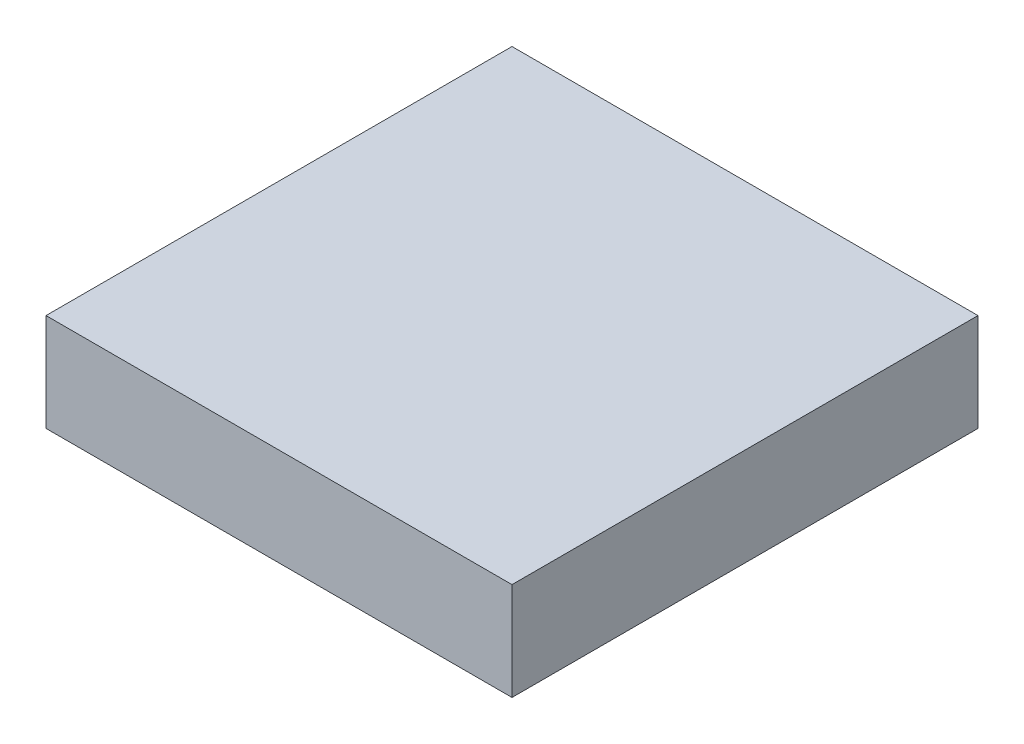
ISO-10303-21;
HEADER;
FILE_DESCRIPTION(('STEP AP214'),'2;1');
FILE_NAME('part.step','',(''),(''),'','','');
FILE_SCHEMA(('AUTOMOTIVE_DESIGN { 1 0 10303 214 1 1 1 1 }'));
ENDSEC;
DATA;
#1=APPLICATION_CONTEXT('core data for automotive mechanical design processes');
#2=APPLICATION_PROTOCOL_DEFINITION('international standard','automotive_design',2000,#1);
#3=PRODUCT_CONTEXT('',#1,'mechanical');
#4=PRODUCT('Part','Part','',(#3));
#5=PRODUCT_RELATED_PRODUCT_CATEGORY('part','',(#4));
#6=PRODUCT_DEFINITION_FORMATION('','',#4);
#7=PRODUCT_DEFINITION_CONTEXT('part definition',#1,'design');
#8=PRODUCT_DEFINITION('design','',#6,#7);
#9=PRODUCT_DEFINITION_SHAPE('','',#8);
#10=(LENGTH_UNIT() NAMED_UNIT(*) SI_UNIT(.MILLI.,.METRE.));
#11=(NAMED_UNIT(*) PLANE_ANGLE_UNIT() SI_UNIT($,.RADIAN.));
#12=(NAMED_UNIT(*) SI_UNIT($,.STERADIAN.) SOLID_ANGLE_UNIT());
#13=UNCERTAINTY_MEASURE_WITH_UNIT(LENGTH_MEASURE(1.E-05),#10,'distance_accuracy_value','');
#14=(GEOMETRIC_REPRESENTATION_CONTEXT(3) GLOBAL_UNCERTAINTY_ASSIGNED_CONTEXT((#13)) GLOBAL_UNIT_ASSIGNED_CONTEXT((#10,
#11,#12)) REPRESENTATION_CONTEXT('',''));
#15=CARTESIAN_POINT('',(0.,0.,0.));
#16=DIRECTION('',(0.,0.,1.));
#17=DIRECTION('',(1.,0.,0.));
#18=AXIS2_PLACEMENT_3D('',#15,#16,#17);
#19=CARTESIAN_POINT('',(0.,0.511,-2.436));
#20=DIRECTION('',(1.,0.,0.));
#21=DIRECTION('',(0.,0.,-1.));
#22=AXIS2_PLACEMENT_3D('',#19,#20,#21);
#23=PLANE('',#22);
#24=DIRECTION('',(0.,0.,1.));
#25=VECTOR('',#24,1.);
#26=CARTESIAN_POINT('',(0.,0.,-2.436));
#27=LINE('',#26,#25);
#28=CARTESIAN_POINT('',(0.,0.,-2.436));
#29=VERTEX_POINT('',#28);
#30=CARTESIAN_POINT('',(0.,0.,0.));
#31=VERTEX_POINT('',#30);
#32=EDGE_CURVE('E96',#29,#31,#27,.T.);
#33=ORIENTED_EDGE('',*,*,#32,.T.);
#34=DIRECTION('',(0.,-1.,0.));
#35=VECTOR('',#34,1.);
#36=CARTESIAN_POINT('',(0.,0.511,0.));
#37=LINE('',#36,#35);
#38=CARTESIAN_POINT('',(0.,0.511,0.));
#39=VERTEX_POINT('',#38);
#40=EDGE_CURVE('E11',#39,#31,#37,.T.);
#41=ORIENTED_EDGE('',*,*,#40,.F.);
#42=DIRECTION('',(0.,0.,1.));
#43=VECTOR('',#42,1.);
#44=CARTESIAN_POINT('',(0.,0.511,-2.436));
#45=LINE('',#44,#43);
#46=CARTESIAN_POINT('',(0.,0.511,-2.436));
#47=VERTEX_POINT('',#46);
#48=EDGE_CURVE('E84',#47,#39,#45,.T.);
#49=ORIENTED_EDGE('',*,*,#48,.F.);
#50=DIRECTION('',(0.,-1.,0.));
#51=VECTOR('',#50,1.);
#52=CARTESIAN_POINT('',(0.,0.511,-2.436));
#53=LINE('',#52,#51);
#54=EDGE_CURVE('E92',#47,#29,#53,.T.);
#55=ORIENTED_EDGE('',*,*,#54,.T.);
#56=EDGE_LOOP('',(#33,#41,#49,#55));
#57=FACE_BOUND('',#56,.T.);
#58=ADVANCED_FACE('F33',(#57),#23,.F.);
#59=CARTESIAN_POINT('',(0.,0.511,0.));
#60=DIRECTION('',(0.,0.,-1.));
#61=DIRECTION('',(-1.,0.,0.));
#62=AXIS2_PLACEMENT_3D('',#59,#60,#61);
#63=PLANE('',#62);
#64=DIRECTION('',(1.,0.,0.));
#65=VECTOR('',#64,1.);
#66=CARTESIAN_POINT('',(0.,0.,0.));
#67=LINE('',#66,#65);
#68=CARTESIAN_POINT('',(2.436,0.,0.));
#69=VERTEX_POINT('',#68);
#70=EDGE_CURVE('E88',#31,#69,#67,.T.);
#71=ORIENTED_EDGE('',*,*,#70,.T.);
#72=DIRECTION('',(0.,-1.,0.));
#73=VECTOR('',#72,1.);
#74=CARTESIAN_POINT('',(2.436,0.511,0.));
#75=LINE('',#74,#73);
#76=CARTESIAN_POINT('',(2.436,0.511,0.));
#77=VERTEX_POINT('',#76);
#78=EDGE_CURVE('E41',#77,#69,#75,.T.);
#79=ORIENTED_EDGE('',*,*,#78,.F.);
#80=DIRECTION('',(1.,0.,0.));
#81=VECTOR('',#80,1.);
#82=CARTESIAN_POINT('',(0.,0.511,0.));
#83=LINE('',#82,#81);
#84=EDGE_CURVE('E79',#39,#77,#83,.T.);
#85=ORIENTED_EDGE('',*,*,#84,.F.);
#86=ORIENTED_EDGE('',*,*,#40,.T.);
#87=EDGE_LOOP('',(#71,#79,#85,#86));
#88=FACE_BOUND('',#87,.T.);
#89=ADVANCED_FACE('F87',(#88),#63,.F.);
#90=CARTESIAN_POINT('',(2.436,0.511,0.));
#91=DIRECTION('',(-1.,0.,0.));
#92=DIRECTION('',(0.,0.,1.));
#93=AXIS2_PLACEMENT_3D('',#90,#91,#92);
#94=PLANE('',#93);
#95=DIRECTION('',(0.,0.,-1.));
#96=VECTOR('',#95,1.);
#97=CARTESIAN_POINT('',(2.436,0.,0.));
#98=LINE('',#97,#96);
#99=CARTESIAN_POINT('',(2.436,0.,-2.436));
#100=VERTEX_POINT('',#99);
#101=EDGE_CURVE('E66',#69,#100,#98,.T.);
#102=ORIENTED_EDGE('',*,*,#101,.T.);
#103=DIRECTION('',(0.,-1.,0.));
#104=VECTOR('',#103,1.);
#105=CARTESIAN_POINT('',(2.436,0.511,-2.436));
#106=LINE('',#105,#104);
#107=CARTESIAN_POINT('',(2.436,0.511,-2.436));
#108=VERTEX_POINT('',#107);
#109=EDGE_CURVE('E89',#108,#100,#106,.T.);
#110=ORIENTED_EDGE('',*,*,#109,.F.);
#111=DIRECTION('',(0.,0.,-1.));
#112=VECTOR('',#111,1.);
#113=CARTESIAN_POINT('',(2.436,0.511,0.));
#114=LINE('',#113,#112);
#115=EDGE_CURVE('E82',#77,#108,#114,.T.);
#116=ORIENTED_EDGE('',*,*,#115,.F.);
#117=ORIENTED_EDGE('',*,*,#78,.T.);
#118=EDGE_LOOP('',(#102,#110,#116,#117));
#119=FACE_BOUND('',#118,.T.);
#120=ADVANCED_FACE('F90',(#119),#94,.F.);
#121=CARTESIAN_POINT('',(2.436,0.511,-2.436));
#122=DIRECTION('',(0.,0.,1.));
#123=DIRECTION('',(1.,0.,0.));
#124=AXIS2_PLACEMENT_3D('',#121,#122,#123);
#125=PLANE('',#124);
#126=DIRECTION('',(-1.,0.,0.));
#127=VECTOR('',#126,1.);
#128=CARTESIAN_POINT('',(2.436,0.,-2.436));
#129=LINE('',#128,#127);
#130=EDGE_CURVE('E72',#100,#29,#129,.T.);
#131=ORIENTED_EDGE('',*,*,#130,.T.);
#132=ORIENTED_EDGE('',*,*,#54,.F.);
#133=DIRECTION('',(-1.,0.,0.));
#134=VECTOR('',#133,1.);
#135=CARTESIAN_POINT('',(2.436,0.511,-2.436));
#136=LINE('',#135,#134);
#137=EDGE_CURVE('E49',#108,#47,#136,.T.);
#138=ORIENTED_EDGE('',*,*,#137,.F.);
#139=ORIENTED_EDGE('',*,*,#109,.T.);
#140=EDGE_LOOP('',(#131,#132,#138,#139));
#141=FACE_BOUND('',#140,.T.);
#142=ADVANCED_FACE('F103',(#141),#125,.F.);
#143=CARTESIAN_POINT('',(0.,0.511,0.));
#144=DIRECTION('',(0.,1.,0.));
#145=DIRECTION('',(0.,0.,1.));
#146=AXIS2_PLACEMENT_3D('',#143,#144,#145);
#147=PLANE('',#146);
#148=ORIENTED_EDGE('',*,*,#48,.T.);
#149=ORIENTED_EDGE('',*,*,#84,.T.);
#150=ORIENTED_EDGE('',*,*,#115,.T.);
#151=ORIENTED_EDGE('',*,*,#137,.T.);
#152=EDGE_LOOP('',(#148,#149,#150,#151));
#153=FACE_BOUND('',#152,.T.);
#154=ADVANCED_FACE('F80',(#153),#147,.T.);
#155=CARTESIAN_POINT('',(0.,0.,0.));
#156=DIRECTION('',(0.,1.,0.));
#157=DIRECTION('',(0.,0.,1.));
#158=AXIS2_PLACEMENT_3D('',#155,#156,#157);
#159=PLANE('',#158);
#160=ORIENTED_EDGE('',*,*,#32,.F.);
#161=ORIENTED_EDGE('',*,*,#130,.F.);
#162=ORIENTED_EDGE('',*,*,#101,.F.);
#163=ORIENTED_EDGE('',*,*,#70,.F.);
#164=EDGE_LOOP('',(#160,#161,#162,#163));
#165=FACE_BOUND('',#164,.T.);
#166=ADVANCED_FACE('F106',(#165),#159,.F.);
#167=CLOSED_SHELL('',(#58,#89,#120,#142,#154,#166));
#168=MANIFOLD_SOLID_BREP('B2',#167);
#169=ADVANCED_BREP_SHAPE_REPRESENTATION('',(#18,#168),#14);
#170=SHAPE_DEFINITION_REPRESENTATION(#9,#169);
ENDSEC;
END-ISO-10303-21;
